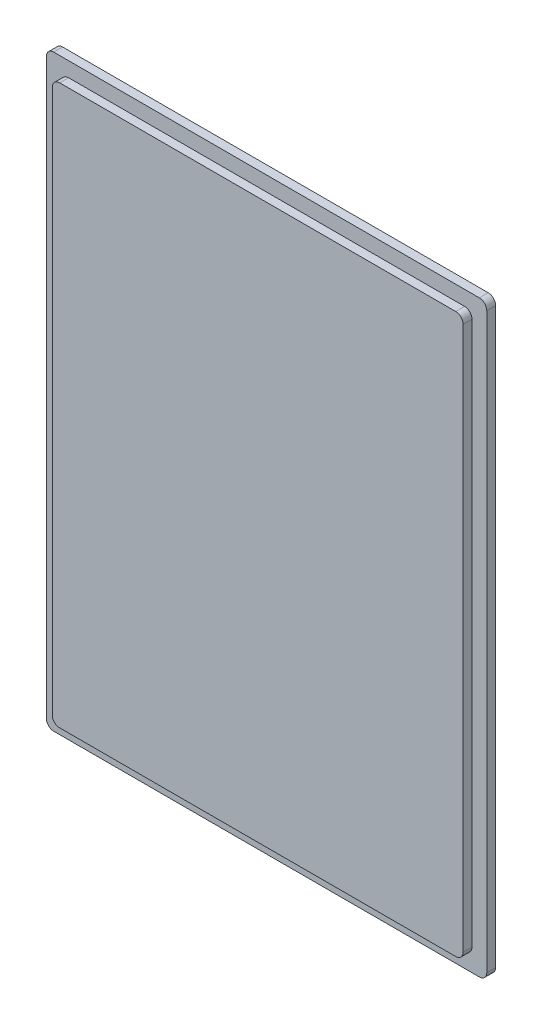
ISO-10303-21;
HEADER;
FILE_DESCRIPTION(('STEP AP214'),'2;1');
FILE_NAME('part.step','',(''),(''),'','','');
FILE_SCHEMA(('AUTOMOTIVE_DESIGN { 1 0 10303 214 1 1 1 1 }'));
ENDSEC;
DATA;
#1=APPLICATION_CONTEXT('core data for automotive mechanical design processes');
#2=APPLICATION_PROTOCOL_DEFINITION('international standard','automotive_design',2000,#1);
#3=PRODUCT_CONTEXT('',#1,'mechanical');
#4=PRODUCT('Part','Part','',(#3));
#5=PRODUCT_RELATED_PRODUCT_CATEGORY('part','',(#4));
#6=PRODUCT_DEFINITION_FORMATION('','',#4);
#7=PRODUCT_DEFINITION_CONTEXT('part definition',#1,'design');
#8=PRODUCT_DEFINITION('design','',#6,#7);
#9=PRODUCT_DEFINITION_SHAPE('','',#8);
#10=(LENGTH_UNIT() NAMED_UNIT(*) SI_UNIT(.MILLI.,.METRE.));
#11=(NAMED_UNIT(*) PLANE_ANGLE_UNIT() SI_UNIT($,.RADIAN.));
#12=(NAMED_UNIT(*) SI_UNIT($,.STERADIAN.) SOLID_ANGLE_UNIT());
#13=UNCERTAINTY_MEASURE_WITH_UNIT(LENGTH_MEASURE(1.E-05),#10,'distance_accuracy_value','');
#14=(GEOMETRIC_REPRESENTATION_CONTEXT(3) GLOBAL_UNCERTAINTY_ASSIGNED_CONTEXT((#13)) GLOBAL_UNIT_ASSIGNED_CONTEXT((#10,
#11,#12)) REPRESENTATION_CONTEXT('',''));
#15=CARTESIAN_POINT('',(0.,0.,0.));
#16=DIRECTION('',(0.,0.,1.));
#17=DIRECTION('',(1.,0.,0.));
#18=AXIS2_PLACEMENT_3D('',#15,#16,#17);
#19=CARTESIAN_POINT('',(-44.8047368846496,-371.465893560001,6.));
#20=DIRECTION('',(0.,0.,1.));
#21=DIRECTION('',(1.,0.,0.));
#22=AXIS2_PLACEMENT_3D('',#19,#20,#21);
#23=PLANE('',#22);
#24=CARTESIAN_POINT('',(-44.8047368846496,-371.465893560001,6.));
#25=DIRECTION('',(0.,0.,1.));
#26=DIRECTION('',(1.,0.,0.));
#27=AXIS2_PLACEMENT_3D('',#24,#25,#26);
#28=CIRCLE('',#27,5.);
#29=CARTESIAN_POINT('',(-49.8047368846496,-371.465893560001,6.));
#30=VERTEX_POINT('',#29);
#31=CARTESIAN_POINT('',(-44.8047368846496,-376.465893560001,6.));
#32=VERTEX_POINT('',#31);
#33=EDGE_CURVE('E214',#30,#32,#28,.T.);
#34=ORIENTED_EDGE('',*,*,#33,.T.);
#35=DIRECTION('',(1.,0.,0.));
#36=VECTOR('',#35,1.);
#37=CARTESIAN_POINT('',(-44.8047368846496,-376.465893560001,6.));
#38=LINE('',#37,#36);
#39=CARTESIAN_POINT('',(243.19526311535,-376.465893560001,6.));
#40=VERTEX_POINT('',#39);
#41=EDGE_CURVE('E217',#32,#40,#38,.T.);
#42=ORIENTED_EDGE('',*,*,#41,.T.);
#43=CARTESIAN_POINT('',(243.19526311535,-371.465893560001,6.));
#44=DIRECTION('',(0.,0.,1.));
#45=DIRECTION('',(1.,0.,0.));
#46=AXIS2_PLACEMENT_3D('',#43,#44,#45);
#47=CIRCLE('',#46,5.);
#48=CARTESIAN_POINT('',(248.19526311535,-371.465893560001,6.));
#49=VERTEX_POINT('',#48);
#50=EDGE_CURVE('E220',#40,#49,#47,.T.);
#51=ORIENTED_EDGE('',*,*,#50,.T.);
#52=DIRECTION('',(0.,1.,0.));
#53=VECTOR('',#52,1.);
#54=CARTESIAN_POINT('',(248.19526311535,-371.465893560001,6.));
#55=LINE('',#54,#53);
#56=CARTESIAN_POINT('',(248.19526311535,16.5341064399992,6.));
#57=VERTEX_POINT('',#56);
#58=EDGE_CURVE('E222',#49,#57,#55,.T.);
#59=ORIENTED_EDGE('',*,*,#58,.T.);
#60=CARTESIAN_POINT('',(243.19526311535,16.5341064399993,6.));
#61=DIRECTION('',(0.,0.,1.));
#62=DIRECTION('',(1.,0.,0.));
#63=AXIS2_PLACEMENT_3D('',#60,#61,#62);
#64=CIRCLE('',#63,5.);
#65=CARTESIAN_POINT('',(243.19526311535,21.5341064399993,6.));
#66=VERTEX_POINT('',#65);
#67=EDGE_CURVE('E224',#57,#66,#64,.T.);
#68=ORIENTED_EDGE('',*,*,#67,.T.);
#69=DIRECTION('',(-1.,0.,0.));
#70=VECTOR('',#69,1.);
#71=CARTESIAN_POINT('',(243.19526311535,21.5341064399993,6.));
#72=LINE('',#71,#70);
#73=CARTESIAN_POINT('',(-44.8047368846496,21.5341064399992,6.));
#74=VERTEX_POINT('',#73);
#75=EDGE_CURVE('E226',#66,#74,#72,.T.);
#76=ORIENTED_EDGE('',*,*,#75,.T.);
#77=CARTESIAN_POINT('',(-44.8047368846496,16.5341064399992,6.));
#78=DIRECTION('',(0.,0.,1.));
#79=DIRECTION('',(1.,0.,0.));
#80=AXIS2_PLACEMENT_3D('',#77,#78,#79);
#81=CIRCLE('',#80,5.);
#82=CARTESIAN_POINT('',(-49.8047368846496,16.5341064399992,6.));
#83=VERTEX_POINT('',#82);
#84=EDGE_CURVE('E228',#74,#83,#81,.T.);
#85=ORIENTED_EDGE('',*,*,#84,.T.);
#86=DIRECTION('',(0.,-1.,0.));
#87=VECTOR('',#86,1.);
#88=CARTESIAN_POINT('',(-49.8047368846496,16.5341064399992,6.));
#89=LINE('',#88,#87);
#90=EDGE_CURVE('E230',#83,#30,#89,.T.);
#91=ORIENTED_EDGE('',*,*,#90,.T.);
#92=EDGE_LOOP('',(#34,#42,#51,#59,#68,#76,#85,#91));
#93=FACE_BOUND('',#92,.T.);
#94=CARTESIAN_POINT('',(233.19526311535,6.53410643999925,6.));
#95=DIRECTION('',(0.,0.,1.));
#96=DIRECTION('',(1.,0.,0.));
#97=AXIS2_PLACEMENT_3D('',#94,#95,#96);
#98=CIRCLE('',#97,5.);
#99=CARTESIAN_POINT('',(238.19526311535,6.53410643999921,6.));
#100=VERTEX_POINT('',#99);
#101=CARTESIAN_POINT('',(233.19526311535,11.5341064399992,6.));
#102=VERTEX_POINT('',#101);
#103=EDGE_CURVE('E165',#100,#102,#98,.T.);
#104=ORIENTED_EDGE('',*,*,#103,.F.);
#105=DIRECTION('',(0.,-1.,0.));
#106=VECTOR('',#105,1.);
#107=CARTESIAN_POINT('',(238.19526311535,6.53410643999921,6.));
#108=LINE('',#107,#106);
#109=CARTESIAN_POINT('',(238.19526311535,-361.465893560001,6.));
#110=VERTEX_POINT('',#109);
#111=EDGE_CURVE('E48',#100,#110,#108,.T.);
#112=ORIENTED_EDGE('',*,*,#111,.T.);
#113=CARTESIAN_POINT('',(233.19526311535,-361.465893560001,6.));
#114=DIRECTION('',(0.,0.,1.));
#115=DIRECTION('',(1.,0.,0.));
#116=AXIS2_PLACEMENT_3D('',#113,#114,#115);
#117=CIRCLE('',#116,5.);
#118=CARTESIAN_POINT('',(233.19526311535,-366.465893560001,6.));
#119=VERTEX_POINT('',#118);
#120=EDGE_CURVE('E53',#119,#110,#117,.T.);
#121=ORIENTED_EDGE('',*,*,#120,.F.);
#122=DIRECTION('',(-1.,0.,0.));
#123=VECTOR('',#122,1.);
#124=CARTESIAN_POINT('',(233.19526311535,-366.465893560001,6.));
#125=LINE('',#124,#123);
#126=CARTESIAN_POINT('',(-34.8047368846496,-366.465893560001,6.));
#127=VERTEX_POINT('',#126);
#128=EDGE_CURVE('E184',#119,#127,#125,.T.);
#129=ORIENTED_EDGE('',*,*,#128,.T.);
#130=CARTESIAN_POINT('',(-34.8047368846496,-361.465893560001,6.));
#131=DIRECTION('',(0.,0.,1.));
#132=DIRECTION('',(1.,0.,0.));
#133=AXIS2_PLACEMENT_3D('',#130,#131,#132);
#134=CIRCLE('',#133,5.);
#135=CARTESIAN_POINT('',(-39.8047368846496,-361.465893560001,6.));
#136=VERTEX_POINT('',#135);
#137=EDGE_CURVE('E186',#136,#127,#134,.T.);
#138=ORIENTED_EDGE('',*,*,#137,.F.);
#139=DIRECTION('',(0.,-1.,0.));
#140=VECTOR('',#139,1.);
#141=CARTESIAN_POINT('',(-39.8047368846497,6.53410643999922,6.));
#142=LINE('',#141,#140);
#143=CARTESIAN_POINT('',(-39.8047368846497,6.53410643999922,6.));
#144=VERTEX_POINT('',#143);
#145=EDGE_CURVE('E189',#144,#136,#142,.T.);
#146=ORIENTED_EDGE('',*,*,#145,.F.);
#147=CARTESIAN_POINT('',(-34.8047368846497,6.53410643999926,6.));
#148=DIRECTION('',(0.,0.,1.));
#149=DIRECTION('',(1.,0.,0.));
#150=AXIS2_PLACEMENT_3D('',#147,#148,#149);
#151=CIRCLE('',#150,5.);
#152=CARTESIAN_POINT('',(-34.8047368846496,11.5341064399993,6.));
#153=VERTEX_POINT('',#152);
#154=EDGE_CURVE('E192',#153,#144,#151,.T.);
#155=ORIENTED_EDGE('',*,*,#154,.F.);
#156=DIRECTION('',(1.,0.,0.));
#157=VECTOR('',#156,1.);
#158=CARTESIAN_POINT('',(-34.8047368846496,11.5341064399993,6.));
#159=LINE('',#158,#157);
#160=EDGE_CURVE('E168',#153,#102,#159,.T.);
#161=ORIENTED_EDGE('',*,*,#160,.T.);
#162=EDGE_LOOP('',(#104,#112,#121,#129,#138,#146,#155,#161));
#163=FACE_BOUND('',#162,.T.);
#164=ADVANCED_FACE('F33',(#93,#163),#23,.T.);
#165=CARTESIAN_POINT('',(-44.8047368846496,-371.465893560001,6.));
#166=DIRECTION('',(0.,0.,-1.));
#167=DIRECTION('',(-1.,0.,0.));
#168=AXIS2_PLACEMENT_3D('',#165,#166,#167);
#169=CYLINDRICAL_SURFACE('',#168,5.);
#170=CARTESIAN_POINT('',(-44.8047368846496,-371.465893560001,0.));
#171=DIRECTION('',(0.,0.,1.));
#172=DIRECTION('',(1.,0.,0.));
#173=AXIS2_PLACEMENT_3D('',#170,#171,#172);
#174=CIRCLE('',#173,5.);
#175=CARTESIAN_POINT('',(-49.8047368846496,-371.465893560001,0.));
#176=VERTEX_POINT('',#175);
#177=CARTESIAN_POINT('',(-44.8047368846496,-376.465893560001,0.));
#178=VERTEX_POINT('',#177);
#179=EDGE_CURVE('E197',#176,#178,#174,.T.);
#180=ORIENTED_EDGE('',*,*,#179,.T.);
#181=DIRECTION('',(0.,0.,-1.));
#182=VECTOR('',#181,1.);
#183=CARTESIAN_POINT('',(-44.8047368846496,-376.465893560001,6.));
#184=LINE('',#183,#182);
#185=EDGE_CURVE('E11',#32,#178,#184,.T.);
#186=ORIENTED_EDGE('',*,*,#185,.F.);
#187=ORIENTED_EDGE('',*,*,#33,.F.);
#188=DIRECTION('',(0.,0.,-1.));
#189=VECTOR('',#188,1.);
#190=CARTESIAN_POINT('',(-49.8047368846496,-371.465893560001,6.));
#191=LINE('',#190,#189);
#192=EDGE_CURVE('E232',#30,#176,#191,.T.);
#193=ORIENTED_EDGE('',*,*,#192,.T.);
#194=EDGE_LOOP('',(#180,#186,#187,#193));
#195=FACE_BOUND('',#194,.T.);
#196=ADVANCED_FACE('F35',(#195),#169,.T.);
#197=CARTESIAN_POINT('',(-44.8047368846496,-376.465893560001,6.));
#198=DIRECTION('',(0.,1.,0.));
#199=DIRECTION('',(0.,0.,1.));
#200=AXIS2_PLACEMENT_3D('',#197,#198,#199);
#201=PLANE('',#200);
#202=DIRECTION('',(1.,0.,0.));
#203=VECTOR('',#202,1.);
#204=CARTESIAN_POINT('',(-44.8047368846496,-376.465893560001,0.));
#205=LINE('',#204,#203);
#206=CARTESIAN_POINT('',(243.19526311535,-376.465893560001,0.));
#207=VERTEX_POINT('',#206);
#208=EDGE_CURVE('E235',#178,#207,#205,.T.);
#209=ORIENTED_EDGE('',*,*,#208,.T.);
#210=DIRECTION('',(0.,0.,-1.));
#211=VECTOR('',#210,1.);
#212=CARTESIAN_POINT('',(243.19526311535,-376.465893560001,6.));
#213=LINE('',#212,#211);
#214=EDGE_CURVE('E41',#40,#207,#213,.T.);
#215=ORIENTED_EDGE('',*,*,#214,.F.);
#216=ORIENTED_EDGE('',*,*,#41,.F.);
#217=ORIENTED_EDGE('',*,*,#185,.T.);
#218=EDGE_LOOP('',(#209,#215,#216,#217));
#219=FACE_BOUND('',#218,.T.);
#220=ADVANCED_FACE('F291',(#219),#201,.F.);
#221=CARTESIAN_POINT('',(243.19526311535,-371.465893560001,6.));
#222=DIRECTION('',(0.,0.,-1.));
#223=DIRECTION('',(-1.,0.,0.));
#224=AXIS2_PLACEMENT_3D('',#221,#222,#223);
#225=CYLINDRICAL_SURFACE('',#224,5.);
#226=CARTESIAN_POINT('',(243.19526311535,-371.465893560001,0.));
#227=DIRECTION('',(0.,0.,1.));
#228=DIRECTION('',(1.,0.,0.));
#229=AXIS2_PLACEMENT_3D('',#226,#227,#228);
#230=CIRCLE('',#229,5.);
#231=CARTESIAN_POINT('',(248.19526311535,-371.465893560001,0.));
#232=VERTEX_POINT('',#231);
#233=EDGE_CURVE('E237',#207,#232,#230,.T.);
#234=ORIENTED_EDGE('',*,*,#233,.T.);
#235=DIRECTION('',(0.,0.,-1.));
#236=VECTOR('',#235,1.);
#237=CARTESIAN_POINT('',(248.19526311535,-371.465893560001,6.));
#238=LINE('',#237,#236);
#239=EDGE_CURVE('E262',#49,#232,#238,.T.);
#240=ORIENTED_EDGE('',*,*,#239,.F.);
#241=ORIENTED_EDGE('',*,*,#50,.F.);
#242=ORIENTED_EDGE('',*,*,#214,.T.);
#243=EDGE_LOOP('',(#234,#240,#241,#242));
#244=FACE_BOUND('',#243,.T.);
#245=ADVANCED_FACE('F269',(#244),#225,.T.);
#246=CARTESIAN_POINT('',(248.19526311535,-371.465893560001,6.));
#247=DIRECTION('',(-1.,0.,0.));
#248=DIRECTION('',(0.,0.,1.));
#249=AXIS2_PLACEMENT_3D('',#246,#247,#248);
#250=PLANE('',#249);
#251=DIRECTION('',(0.,1.,0.));
#252=VECTOR('',#251,1.);
#253=CARTESIAN_POINT('',(248.19526311535,-371.465893560001,0.));
#254=LINE('',#253,#252);
#255=CARTESIAN_POINT('',(248.19526311535,16.5341064399992,0.));
#256=VERTEX_POINT('',#255);
#257=EDGE_CURVE('E239',#232,#256,#254,.T.);
#258=ORIENTED_EDGE('',*,*,#257,.T.);
#259=DIRECTION('',(0.,0.,-1.));
#260=VECTOR('',#259,1.);
#261=CARTESIAN_POINT('',(248.19526311535,16.5341064399992,6.));
#262=LINE('',#261,#260);
#263=EDGE_CURVE('E259',#57,#256,#262,.T.);
#264=ORIENTED_EDGE('',*,*,#263,.F.);
#265=ORIENTED_EDGE('',*,*,#58,.F.);
#266=ORIENTED_EDGE('',*,*,#239,.T.);
#267=EDGE_LOOP('',(#258,#264,#265,#266));
#268=FACE_BOUND('',#267,.T.);
#269=ADVANCED_FACE('F280',(#268),#250,.F.);
#270=CARTESIAN_POINT('',(243.19526311535,16.5341064399993,6.));
#271=DIRECTION('',(0.,0.,-1.));
#272=DIRECTION('',(-1.,0.,0.));
#273=AXIS2_PLACEMENT_3D('',#270,#271,#272);
#274=CYLINDRICAL_SURFACE('',#273,5.);
#275=CARTESIAN_POINT('',(243.19526311535,16.5341064399993,0.));
#276=DIRECTION('',(0.,0.,1.));
#277=DIRECTION('',(1.,0.,0.));
#278=AXIS2_PLACEMENT_3D('',#275,#276,#277);
#279=CIRCLE('',#278,5.);
#280=CARTESIAN_POINT('',(243.19526311535,21.5341064399993,0.));
#281=VERTEX_POINT('',#280);
#282=EDGE_CURVE('E241',#256,#281,#279,.T.);
#283=ORIENTED_EDGE('',*,*,#282,.T.);
#284=DIRECTION('',(0.,0.,-1.));
#285=VECTOR('',#284,1.);
#286=CARTESIAN_POINT('',(243.19526311535,21.5341064399993,6.));
#287=LINE('',#286,#285);
#288=EDGE_CURVE('E256',#66,#281,#287,.T.);
#289=ORIENTED_EDGE('',*,*,#288,.F.);
#290=ORIENTED_EDGE('',*,*,#67,.F.);
#291=ORIENTED_EDGE('',*,*,#263,.T.);
#292=EDGE_LOOP('',(#283,#289,#290,#291));
#293=FACE_BOUND('',#292,.T.);
#294=ADVANCED_FACE('F284',(#293),#274,.T.);
#295=CARTESIAN_POINT('',(243.19526311535,21.5341064399993,6.));
#296=DIRECTION('',(0.,-1.,0.));
#297=DIRECTION('',(1.,0.,0.));
#298=AXIS2_PLACEMENT_3D('',#295,#296,#297);
#299=PLANE('',#298);
#300=DIRECTION('',(-1.,0.,0.));
#301=VECTOR('',#300,1.);
#302=CARTESIAN_POINT('',(243.19526311535,21.5341064399993,0.));
#303=LINE('',#302,#301);
#304=CARTESIAN_POINT('',(-44.8047368846496,21.5341064399992,0.));
#305=VERTEX_POINT('',#304);
#306=EDGE_CURVE('E243',#281,#305,#303,.T.);
#307=ORIENTED_EDGE('',*,*,#306,.T.);
#308=DIRECTION('',(0.,0.,-1.));
#309=VECTOR('',#308,1.);
#310=CARTESIAN_POINT('',(-44.8047368846496,21.5341064399992,6.));
#311=LINE('',#310,#309);
#312=EDGE_CURVE('E253',#74,#305,#311,.T.);
#313=ORIENTED_EDGE('',*,*,#312,.F.);
#314=ORIENTED_EDGE('',*,*,#75,.F.);
#315=ORIENTED_EDGE('',*,*,#288,.T.);
#316=EDGE_LOOP('',(#307,#313,#314,#315));
#317=FACE_BOUND('',#316,.T.);
#318=ADVANCED_FACE('F304',(#317),#299,.F.);
#319=CARTESIAN_POINT('',(-44.8047368846496,16.5341064399992,6.));
#320=DIRECTION('',(0.,0.,-1.));
#321=DIRECTION('',(-1.,0.,0.));
#322=AXIS2_PLACEMENT_3D('',#319,#320,#321);
#323=CYLINDRICAL_SURFACE('',#322,5.);
#324=CARTESIAN_POINT('',(-44.8047368846496,16.5341064399992,0.));
#325=DIRECTION('',(0.,0.,1.));
#326=DIRECTION('',(1.,0.,0.));
#327=AXIS2_PLACEMENT_3D('',#324,#325,#326);
#328=CIRCLE('',#327,5.);
#329=CARTESIAN_POINT('',(-49.8047368846496,16.5341064399992,0.));
#330=VERTEX_POINT('',#329);
#331=EDGE_CURVE('E245',#305,#330,#328,.T.);
#332=ORIENTED_EDGE('',*,*,#331,.T.);
#333=DIRECTION('',(0.,0.,-1.));
#334=VECTOR('',#333,1.);
#335=CARTESIAN_POINT('',(-49.8047368846496,16.5341064399992,6.));
#336=LINE('',#335,#334);
#337=EDGE_CURVE('E250',#83,#330,#336,.T.);
#338=ORIENTED_EDGE('',*,*,#337,.F.);
#339=ORIENTED_EDGE('',*,*,#84,.F.);
#340=ORIENTED_EDGE('',*,*,#312,.T.);
#341=EDGE_LOOP('',(#332,#338,#339,#340));
#342=FACE_BOUND('',#341,.T.);
#343=ADVANCED_FACE('F302',(#342),#323,.T.);
#344=CARTESIAN_POINT('',(-49.8047368846496,16.5341064399992,6.));
#345=DIRECTION('',(1.,0.,0.));
#346=DIRECTION('',(0.,1.,0.));
#347=AXIS2_PLACEMENT_3D('',#344,#345,#346);
#348=PLANE('',#347);
#349=DIRECTION('',(0.,-1.,0.));
#350=VECTOR('',#349,1.);
#351=CARTESIAN_POINT('',(-49.8047368846496,16.5341064399992,0.));
#352=LINE('',#351,#350);
#353=EDGE_CURVE('E218',#330,#176,#352,.T.);
#354=ORIENTED_EDGE('',*,*,#353,.T.);
#355=ORIENTED_EDGE('',*,*,#192,.F.);
#356=ORIENTED_EDGE('',*,*,#90,.F.);
#357=ORIENTED_EDGE('',*,*,#337,.T.);
#358=EDGE_LOOP('',(#354,#355,#356,#357));
#359=FACE_BOUND('',#358,.T.);
#360=ADVANCED_FACE('F297',(#359),#348,.F.);
#361=CARTESIAN_POINT('',(-44.8047368846496,-371.465893560001,0.));
#362=DIRECTION('',(0.,0.,1.));
#363=DIRECTION('',(1.,0.,0.));
#364=AXIS2_PLACEMENT_3D('',#361,#362,#363);
#365=PLANE('',#364);
#366=ORIENTED_EDGE('',*,*,#179,.F.);
#367=ORIENTED_EDGE('',*,*,#353,.F.);
#368=ORIENTED_EDGE('',*,*,#331,.F.);
#369=ORIENTED_EDGE('',*,*,#306,.F.);
#370=ORIENTED_EDGE('',*,*,#282,.F.);
#371=ORIENTED_EDGE('',*,*,#257,.F.);
#372=ORIENTED_EDGE('',*,*,#233,.F.);
#373=ORIENTED_EDGE('',*,*,#208,.F.);
#374=EDGE_LOOP('',(#366,#367,#368,#369,#370,#371,#372,#373));
#375=FACE_BOUND('',#374,.T.);
#376=ADVANCED_FACE('F275',(#375),#365,.F.);
#377=CARTESIAN_POINT('',(238.19526311535,6.53410643999921,12.));
#378=DIRECTION('',(1.,0.,0.));
#379=DIRECTION('',(0.,0.,-1.));
#380=AXIS2_PLACEMENT_3D('',#377,#378,#379);
#381=PLANE('',#380);
#382=ORIENTED_EDGE('',*,*,#111,.F.);
#383=DIRECTION('',(0.,0.,-1.));
#384=VECTOR('',#383,1.);
#385=CARTESIAN_POINT('',(238.19526311535,6.53410643999921,12.));
#386=LINE('',#385,#384);
#387=CARTESIAN_POINT('',(238.19526311535,6.53410643999921,12.));
#388=VERTEX_POINT('',#387);
#389=EDGE_CURVE('E163',#388,#100,#386,.T.);
#390=ORIENTED_EDGE('',*,*,#389,.F.);
#391=DIRECTION('',(0.,-1.,0.));
#392=VECTOR('',#391,1.);
#393=CARTESIAN_POINT('',(238.19526311535,6.53410643999921,12.));
#394=LINE('',#393,#392);
#395=CARTESIAN_POINT('',(238.19526311535,-361.465893560001,12.));
#396=VERTEX_POINT('',#395);
#397=EDGE_CURVE('E150',#388,#396,#394,.T.);
#398=ORIENTED_EDGE('',*,*,#397,.T.);
#399=DIRECTION('',(0.,0.,-1.));
#400=VECTOR('',#399,1.);
#401=CARTESIAN_POINT('',(238.19526311535,-361.465893560001,12.));
#402=LINE('',#401,#400);
#403=EDGE_CURVE('E155',#396,#110,#402,.T.);
#404=ORIENTED_EDGE('',*,*,#403,.T.);
#405=EDGE_LOOP('',(#382,#390,#398,#404));
#406=FACE_BOUND('',#405,.T.);
#407=ADVANCED_FACE('F161',(#406),#381,.T.);
#408=CARTESIAN_POINT('',(233.19526311535,6.53410643999925,12.));
#409=DIRECTION('',(0.,0.,-1.));
#410=DIRECTION('',(-1.,0.,0.));
#411=AXIS2_PLACEMENT_3D('',#408,#409,#410);
#412=CYLINDRICAL_SURFACE('',#411,5.);
#413=ORIENTED_EDGE('',*,*,#103,.T.);
#414=DIRECTION('',(0.,0.,-1.));
#415=VECTOR('',#414,1.);
#416=CARTESIAN_POINT('',(233.19526311535,11.5341064399992,12.));
#417=LINE('',#416,#415);
#418=CARTESIAN_POINT('',(233.19526311535,11.5341064399992,12.));
#419=VERTEX_POINT('',#418);
#420=EDGE_CURVE('E198',#419,#102,#417,.T.);
#421=ORIENTED_EDGE('',*,*,#420,.F.);
#422=CARTESIAN_POINT('',(233.19526311535,6.53410643999925,12.));
#423=DIRECTION('',(0.,0.,1.));
#424=DIRECTION('',(1.,0.,0.));
#425=AXIS2_PLACEMENT_3D('',#422,#423,#424);
#426=CIRCLE('',#425,5.);
#427=EDGE_CURVE('E159',#388,#419,#426,.T.);
#428=ORIENTED_EDGE('',*,*,#427,.F.);
#429=ORIENTED_EDGE('',*,*,#389,.T.);
#430=EDGE_LOOP('',(#413,#421,#428,#429));
#431=FACE_BOUND('',#430,.T.);
#432=ADVANCED_FACE('F338',(#431),#412,.T.);
#433=CARTESIAN_POINT('',(-34.8047368846496,11.5341064399993,12.));
#434=DIRECTION('',(0.,1.,0.));
#435=DIRECTION('',(-1.,0.,0.));
#436=AXIS2_PLACEMENT_3D('',#433,#434,#435);
#437=PLANE('',#436);
#438=ORIENTED_EDGE('',*,*,#160,.F.);
#439=DIRECTION('',(0.,0.,-1.));
#440=VECTOR('',#439,1.);
#441=CARTESIAN_POINT('',(-34.8047368846496,11.5341064399993,12.));
#442=LINE('',#441,#440);
#443=CARTESIAN_POINT('',(-34.8047368846496,11.5341064399993,12.));
#444=VERTEX_POINT('',#443);
#445=EDGE_CURVE('E201',#444,#153,#442,.T.);
#446=ORIENTED_EDGE('',*,*,#445,.F.);
#447=DIRECTION('',(1.,0.,0.));
#448=VECTOR('',#447,1.);
#449=CARTESIAN_POINT('',(-34.8047368846496,11.5341064399993,12.));
#450=LINE('',#449,#448);
#451=EDGE_CURVE('E178',#444,#419,#450,.T.);
#452=ORIENTED_EDGE('',*,*,#451,.T.);
#453=ORIENTED_EDGE('',*,*,#420,.T.);
#454=EDGE_LOOP('',(#438,#446,#452,#453));
#455=FACE_BOUND('',#454,.T.);
#456=ADVANCED_FACE('F344',(#455),#437,.T.);
#457=CARTESIAN_POINT('',(-34.8047368846497,6.53410643999926,12.));
#458=DIRECTION('',(0.,0.,-1.));
#459=DIRECTION('',(-1.,0.,0.));
#460=AXIS2_PLACEMENT_3D('',#457,#458,#459);
#461=CYLINDRICAL_SURFACE('',#460,5.);
#462=ORIENTED_EDGE('',*,*,#154,.T.);
#463=DIRECTION('',(0.,0.,-1.));
#464=VECTOR('',#463,1.);
#465=CARTESIAN_POINT('',(-39.8047368846497,6.53410643999922,12.));
#466=LINE('',#465,#464);
#467=CARTESIAN_POINT('',(-39.8047368846497,6.53410643999922,12.));
#468=VERTEX_POINT('',#467);
#469=EDGE_CURVE('E204',#468,#144,#466,.T.);
#470=ORIENTED_EDGE('',*,*,#469,.F.);
#471=CARTESIAN_POINT('',(-34.8047368846497,6.53410643999926,12.));
#472=DIRECTION('',(0.,0.,1.));
#473=DIRECTION('',(1.,0.,0.));
#474=AXIS2_PLACEMENT_3D('',#471,#472,#473);
#475=CIRCLE('',#474,5.);
#476=EDGE_CURVE('E176',#444,#468,#475,.T.);
#477=ORIENTED_EDGE('',*,*,#476,.F.);
#478=ORIENTED_EDGE('',*,*,#445,.T.);
#479=EDGE_LOOP('',(#462,#470,#477,#478));
#480=FACE_BOUND('',#479,.T.);
#481=ADVANCED_FACE('F352',(#480),#461,.T.);
#482=CARTESIAN_POINT('',(-39.8047368846497,6.53410643999922,12.));
#483=DIRECTION('',(1.,0.,0.));
#484=DIRECTION('',(0.,1.,0.));
#485=AXIS2_PLACEMENT_3D('',#482,#483,#484);
#486=PLANE('',#485);
#487=ORIENTED_EDGE('',*,*,#145,.T.);
#488=DIRECTION('',(0.,0.,-1.));
#489=VECTOR('',#488,1.);
#490=CARTESIAN_POINT('',(-39.8047368846496,-361.465893560001,12.));
#491=LINE('',#490,#489);
#492=CARTESIAN_POINT('',(-39.8047368846496,-361.465893560001,12.));
#493=VERTEX_POINT('',#492);
#494=EDGE_CURVE('E207',#493,#136,#491,.T.);
#495=ORIENTED_EDGE('',*,*,#494,.F.);
#496=DIRECTION('',(0.,-1.,0.));
#497=VECTOR('',#496,1.);
#498=CARTESIAN_POINT('',(-39.8047368846497,6.53410643999922,12.));
#499=LINE('',#498,#497);
#500=EDGE_CURVE('E174',#468,#493,#499,.T.);
#501=ORIENTED_EDGE('',*,*,#500,.F.);
#502=ORIENTED_EDGE('',*,*,#469,.T.);
#503=EDGE_LOOP('',(#487,#495,#501,#502));
#504=FACE_BOUND('',#503,.T.);
#505=ADVANCED_FACE('F360',(#504),#486,.F.);
#506=CARTESIAN_POINT('',(-34.8047368846496,-361.465893560001,12.));
#507=DIRECTION('',(0.,0.,-1.));
#508=DIRECTION('',(-1.,0.,0.));
#509=AXIS2_PLACEMENT_3D('',#506,#507,#508);
#510=CYLINDRICAL_SURFACE('',#509,5.);
#511=ORIENTED_EDGE('',*,*,#137,.T.);
#512=DIRECTION('',(0.,0.,-1.));
#513=VECTOR('',#512,1.);
#514=CARTESIAN_POINT('',(-34.8047368846496,-366.465893560001,12.));
#515=LINE('',#514,#513);
#516=CARTESIAN_POINT('',(-34.8047368846496,-366.465893560001,12.));
#517=VERTEX_POINT('',#516);
#518=EDGE_CURVE('E210',#517,#127,#515,.T.);
#519=ORIENTED_EDGE('',*,*,#518,.F.);
#520=CARTESIAN_POINT('',(-34.8047368846496,-361.465893560001,12.));
#521=DIRECTION('',(0.,0.,1.));
#522=DIRECTION('',(1.,0.,0.));
#523=AXIS2_PLACEMENT_3D('',#520,#521,#522);
#524=CIRCLE('',#523,5.);
#525=EDGE_CURVE('E172',#493,#517,#524,.T.);
#526=ORIENTED_EDGE('',*,*,#525,.F.);
#527=ORIENTED_EDGE('',*,*,#494,.T.);
#528=EDGE_LOOP('',(#511,#519,#526,#527));
#529=FACE_BOUND('',#528,.T.);
#530=ADVANCED_FACE('F368',(#529),#510,.T.);
#531=CARTESIAN_POINT('',(233.19526311535,-366.465893560001,12.));
#532=DIRECTION('',(0.,-1.,0.));
#533=DIRECTION('',(0.,0.,-1.));
#534=AXIS2_PLACEMENT_3D('',#531,#532,#533);
#535=PLANE('',#534);
#536=ORIENTED_EDGE('',*,*,#128,.F.);
#537=DIRECTION('',(0.,0.,-1.));
#538=VECTOR('',#537,1.);
#539=CARTESIAN_POINT('',(233.19526311535,-366.465893560001,12.));
#540=LINE('',#539,#538);
#541=CARTESIAN_POINT('',(233.19526311535,-366.465893560001,12.));
#542=VERTEX_POINT('',#541);
#543=EDGE_CURVE('E158',#542,#119,#540,.T.);
#544=ORIENTED_EDGE('',*,*,#543,.F.);
#545=DIRECTION('',(-1.,0.,0.));
#546=VECTOR('',#545,1.);
#547=CARTESIAN_POINT('',(233.19526311535,-366.465893560001,12.));
#548=LINE('',#547,#546);
#549=EDGE_CURVE('E152',#542,#517,#548,.T.);
#550=ORIENTED_EDGE('',*,*,#549,.T.);
#551=ORIENTED_EDGE('',*,*,#518,.T.);
#552=EDGE_LOOP('',(#536,#544,#550,#551));
#553=FACE_BOUND('',#552,.T.);
#554=ADVANCED_FACE('F376',(#553),#535,.T.);
#555=CARTESIAN_POINT('',(233.19526311535,-361.465893560001,12.));
#556=DIRECTION('',(0.,0.,-1.));
#557=DIRECTION('',(-1.,0.,0.));
#558=AXIS2_PLACEMENT_3D('',#555,#556,#557);
#559=CYLINDRICAL_SURFACE('',#558,5.);
#560=ORIENTED_EDGE('',*,*,#120,.T.);
#561=ORIENTED_EDGE('',*,*,#403,.F.);
#562=CARTESIAN_POINT('',(233.19526311535,-361.465893560001,12.));
#563=DIRECTION('',(0.,0.,1.));
#564=DIRECTION('',(1.,0.,0.));
#565=AXIS2_PLACEMENT_3D('',#562,#563,#564);
#566=CIRCLE('',#565,5.);
#567=EDGE_CURVE('E146',#542,#396,#566,.T.);
#568=ORIENTED_EDGE('',*,*,#567,.F.);
#569=ORIENTED_EDGE('',*,*,#543,.T.);
#570=EDGE_LOOP('',(#560,#561,#568,#569));
#571=FACE_BOUND('',#570,.T.);
#572=ADVANCED_FACE('F156',(#571),#559,.T.);
#573=CARTESIAN_POINT('',(233.19526311535,-361.465893560001,12.));
#574=DIRECTION('',(0.,0.,1.));
#575=DIRECTION('',(1.,0.,0.));
#576=AXIS2_PLACEMENT_3D('',#573,#574,#575);
#577=PLANE('',#576);
#578=ORIENTED_EDGE('',*,*,#397,.F.);
#579=ORIENTED_EDGE('',*,*,#427,.T.);
#580=ORIENTED_EDGE('',*,*,#451,.F.);
#581=ORIENTED_EDGE('',*,*,#476,.T.);
#582=ORIENTED_EDGE('',*,*,#500,.T.);
#583=ORIENTED_EDGE('',*,*,#525,.T.);
#584=ORIENTED_EDGE('',*,*,#549,.F.);
#585=ORIENTED_EDGE('',*,*,#567,.T.);
#586=EDGE_LOOP('',(#578,#579,#580,#581,#582,#583,#584,#585));
#587=FACE_BOUND('',#586,.T.);
#588=ADVANCED_FACE('F148',(#587),#577,.T.);
#589=CLOSED_SHELL('',(#164,#196,#220,#245,#269,#294,#318,#343,#360,#376,#407,#432,#456,#481,
#505,#530,#554,#572,#588));
#590=MANIFOLD_SOLID_BREP('B2',#589);
#591=ADVANCED_BREP_SHAPE_REPRESENTATION('',(#18,#590),#14);
#592=SHAPE_DEFINITION_REPRESENTATION(#9,#591);
ENDSEC;
END-ISO-10303-21;
